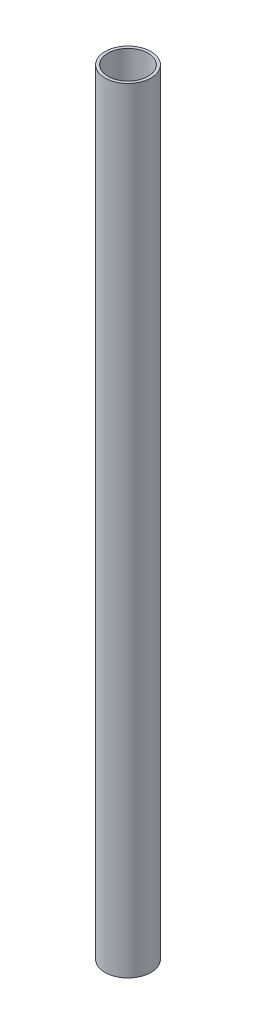
ISO-10303-21;
HEADER;
FILE_DESCRIPTION(('STEP AP214'),'2;1');
FILE_NAME('part.step','',(''),(''),'','','');
FILE_SCHEMA(('AUTOMOTIVE_DESIGN { 1 0 10303 214 1 1 1 1 }'));
ENDSEC;
DATA;
#1=APPLICATION_CONTEXT('core data for automotive mechanical design processes');
#2=APPLICATION_PROTOCOL_DEFINITION('international standard','automotive_design',2000,#1);
#3=PRODUCT_CONTEXT('',#1,'mechanical');
#4=PRODUCT('Part','Part','',(#3));
#5=PRODUCT_RELATED_PRODUCT_CATEGORY('part','',(#4));
#6=PRODUCT_DEFINITION_FORMATION('','',#4);
#7=PRODUCT_DEFINITION_CONTEXT('part definition',#1,'design');
#8=PRODUCT_DEFINITION('design','',#6,#7);
#9=PRODUCT_DEFINITION_SHAPE('','',#8);
#10=(LENGTH_UNIT() NAMED_UNIT(*) SI_UNIT(.MILLI.,.METRE.));
#11=(NAMED_UNIT(*) PLANE_ANGLE_UNIT() SI_UNIT($,.RADIAN.));
#12=(NAMED_UNIT(*) SI_UNIT($,.STERADIAN.) SOLID_ANGLE_UNIT());
#13=UNCERTAINTY_MEASURE_WITH_UNIT(LENGTH_MEASURE(1.E-05),#10,'distance_accuracy_value','');
#14=(GEOMETRIC_REPRESENTATION_CONTEXT(3) GLOBAL_UNCERTAINTY_ASSIGNED_CONTEXT((#13)) GLOBAL_UNIT_ASSIGNED_CONTEXT((#10,
#11,#12)) REPRESENTATION_CONTEXT('',''));
#15=CARTESIAN_POINT('',(0.,0.,0.));
#16=DIRECTION('',(0.,0.,1.));
#17=DIRECTION('',(1.,0.,0.));
#18=AXIS2_PLACEMENT_3D('',#15,#16,#17);
#19=CARTESIAN_POINT('',(0.,270.,0.));
#20=DIRECTION('',(0.,1.,0.));
#21=DIRECTION('',(0.,0.,1.));
#22=AXIS2_PLACEMENT_3D('',#19,#20,#21);
#23=PLANE('',#22);
#24=CARTESIAN_POINT('',(0.,270.,0.));
#25=DIRECTION('',(0.,1.,0.));
#26=DIRECTION('',(0.,0.,1.));
#27=AXIS2_PLACEMENT_3D('',#24,#25,#26);
#28=CIRCLE('',#27,8.);
#29=CARTESIAN_POINT('',(0.,270.,8.));
#30=VERTEX_POINT('',#29);
#31=EDGE_CURVE('E10',#30,#30,#28,.T.);
#32=ORIENTED_EDGE('',*,*,#31,.T.);
#33=EDGE_LOOP('',(#32));
#34=FACE_BOUND('',#33,.T.);
#35=CARTESIAN_POINT('',(0.,270.,0.));
#36=DIRECTION('',(0.,1.,0.));
#37=DIRECTION('',(0.,0.,1.));
#38=AXIS2_PLACEMENT_3D('',#35,#36,#37);
#39=CIRCLE('',#38,7.);
#40=CARTESIAN_POINT('',(0.,270.,7.));
#41=VERTEX_POINT('',#40);
#42=EDGE_CURVE('E47',#41,#41,#39,.T.);
#43=ORIENTED_EDGE('',*,*,#42,.F.);
#44=EDGE_LOOP('',(#43));
#45=FACE_BOUND('',#44,.T.);
#46=ADVANCED_FACE('F36',(#34,#45),#23,.T.);
#47=CARTESIAN_POINT('',(0.,0.,0.));
#48=DIRECTION('',(0.,1.,0.));
#49=DIRECTION('',(0.,0.,1.));
#50=AXIS2_PLACEMENT_3D('',#47,#48,#49);
#51=PLANE('',#50);
#52=CARTESIAN_POINT('',(0.,0.,0.));
#53=DIRECTION('',(0.,1.,0.));
#54=DIRECTION('',(0.,0.,1.));
#55=AXIS2_PLACEMENT_3D('',#52,#53,#54);
#56=CIRCLE('',#55,8.);
#57=CARTESIAN_POINT('',(0.,0.,8.));
#58=VERTEX_POINT('',#57);
#59=EDGE_CURVE('E40',#58,#58,#56,.T.);
#60=ORIENTED_EDGE('',*,*,#59,.F.);
#61=EDGE_LOOP('',(#60));
#62=FACE_BOUND('',#61,.T.);
#63=CARTESIAN_POINT('',(0.,0.,0.));
#64=DIRECTION('',(0.,1.,0.));
#65=DIRECTION('',(0.,0.,1.));
#66=AXIS2_PLACEMENT_3D('',#63,#64,#65);
#67=CIRCLE('',#66,7.);
#68=CARTESIAN_POINT('',(0.,0.,7.));
#69=VERTEX_POINT('',#68);
#70=EDGE_CURVE('E49',#69,#69,#67,.T.);
#71=ORIENTED_EDGE('',*,*,#70,.T.);
#72=EDGE_LOOP('',(#71));
#73=FACE_BOUND('',#72,.T.);
#74=ADVANCED_FACE('F59',(#62,#73),#51,.F.);
#75=CARTESIAN_POINT('',(0.,270.,0.));
#76=DIRECTION('',(0.,-1.,0.));
#77=DIRECTION('',(0.,0.,-1.));
#78=AXIS2_PLACEMENT_3D('',#75,#76,#77);
#79=CYLINDRICAL_SURFACE('',#78,8.);
#80=ORIENTED_EDGE('',*,*,#31,.F.);
#81=EDGE_LOOP('',(#80));
#82=FACE_BOUND('',#81,.T.);
#83=ORIENTED_EDGE('',*,*,#59,.T.);
#84=EDGE_LOOP('',(#83));
#85=FACE_BOUND('',#84,.T.);
#86=ADVANCED_FACE('F38',(#82,#85),#79,.T.);
#87=CARTESIAN_POINT('',(0.,270.,0.));
#88=DIRECTION('',(0.,-1.,0.));
#89=DIRECTION('',(0.,0.,-1.));
#90=AXIS2_PLACEMENT_3D('',#87,#88,#89);
#91=CYLINDRICAL_SURFACE('',#90,7.);
#92=ORIENTED_EDGE('',*,*,#42,.T.);
#93=EDGE_LOOP('',(#92));
#94=FACE_BOUND('',#93,.T.);
#95=ORIENTED_EDGE('',*,*,#70,.F.);
#96=EDGE_LOOP('',(#95));
#97=FACE_BOUND('',#96,.T.);
#98=ADVANCED_FACE('F55',(#94,#97),#91,.F.);
#99=CLOSED_SHELL('',(#46,#74,#86,#98));
#100=MANIFOLD_SOLID_BREP('B2',#99);
#101=ADVANCED_BREP_SHAPE_REPRESENTATION('',(#18,#100),#14);
#102=SHAPE_DEFINITION_REPRESENTATION(#9,#101);
ENDSEC;
END-ISO-10303-21;
